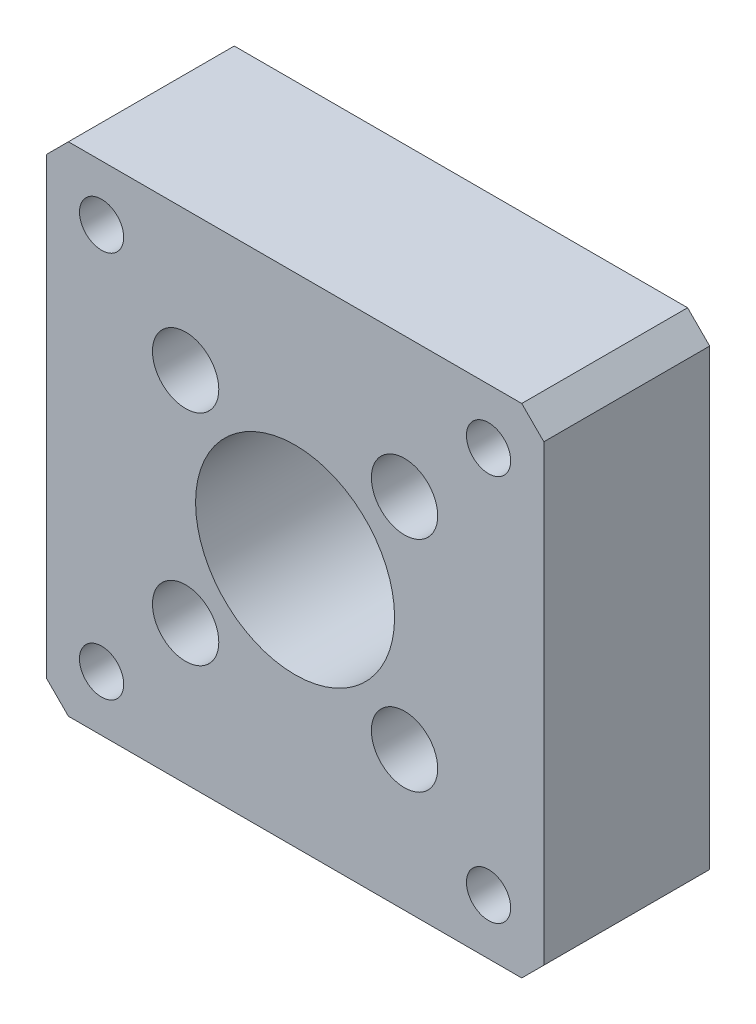
ISO-10303-21;
HEADER;
FILE_DESCRIPTION(('STEP AP214'),'2;1');
FILE_NAME('part.step','',(''),(''),'','','');
FILE_SCHEMA(('AUTOMOTIVE_DESIGN { 1 0 10303 214 1 1 1 1 }'));
ENDSEC;
DATA;
#1=APPLICATION_CONTEXT('core data for automotive mechanical design processes');
#2=APPLICATION_PROTOCOL_DEFINITION('international standard','automotive_design',2000,#1);
#3=PRODUCT_CONTEXT('',#1,'mechanical');
#4=PRODUCT('Part','Part','',(#3));
#5=PRODUCT_RELATED_PRODUCT_CATEGORY('part','',(#4));
#6=PRODUCT_DEFINITION_FORMATION('','',#4);
#7=PRODUCT_DEFINITION_CONTEXT('part definition',#1,'design');
#8=PRODUCT_DEFINITION('design','',#6,#7);
#9=PRODUCT_DEFINITION_SHAPE('','',#8);
#10=(LENGTH_UNIT() NAMED_UNIT(*) SI_UNIT(.MILLI.,.METRE.));
#11=(NAMED_UNIT(*) PLANE_ANGLE_UNIT() SI_UNIT($,.RADIAN.));
#12=(NAMED_UNIT(*) SI_UNIT($,.STERADIAN.) SOLID_ANGLE_UNIT());
#13=UNCERTAINTY_MEASURE_WITH_UNIT(LENGTH_MEASURE(1.E-05),#10,'distance_accuracy_value','');
#14=(GEOMETRIC_REPRESENTATION_CONTEXT(3) GLOBAL_UNCERTAINTY_ASSIGNED_CONTEXT((#13)) GLOBAL_UNIT_ASSIGNED_CONTEXT((#10,
#11,#12)) REPRESENTATION_CONTEXT('',''));
#15=CARTESIAN_POINT('',(0.,0.,0.));
#16=DIRECTION('',(0.,0.,1.));
#17=DIRECTION('',(1.,0.,0.));
#18=AXIS2_PLACEMENT_3D('',#15,#16,#17);
#19=CARTESIAN_POINT('',(0.,0.,15.));
#20=DIRECTION('',(0.,0.,-1.));
#21=DIRECTION('',(-1.,0.,0.));
#22=AXIS2_PLACEMENT_3D('',#19,#20,#21);
#23=CYLINDRICAL_SURFACE('',#22,9.);
#24=CARTESIAN_POINT('',(0.,0.,15.));
#25=DIRECTION('',(0.,0.,1.));
#26=DIRECTION('',(1.,0.,0.));
#27=AXIS2_PLACEMENT_3D('',#24,#25,#26);
#28=CIRCLE('',#27,9.);
#29=CARTESIAN_POINT('',(9.,0.,15.));
#30=VERTEX_POINT('',#29);
#31=EDGE_CURVE('E182',#30,#30,#28,.T.);
#32=ORIENTED_EDGE('',*,*,#31,.T.);
#33=EDGE_LOOP('',(#32));
#34=FACE_BOUND('',#33,.T.);
#35=CARTESIAN_POINT('',(0.,0.,2.));
#36=DIRECTION('',(0.,0.,-1.));
#37=DIRECTION('',(-1.,0.,0.));
#38=AXIS2_PLACEMENT_3D('',#35,#36,#37);
#39=CIRCLE('',#38,9.);
#40=CARTESIAN_POINT('',(-9.,0.,2.));
#41=VERTEX_POINT('',#40);
#42=EDGE_CURVE('E39',#41,#41,#39,.T.);
#43=ORIENTED_EDGE('',*,*,#42,.T.);
#44=EDGE_LOOP('',(#43));
#45=FACE_BOUND('',#44,.T.);
#46=ADVANCED_FACE('F35',(#34,#45),#23,.F.);
#47=CARTESIAN_POINT('',(9.89949493661165,9.89949493661168,-4.66690475583216));
#48=DIRECTION('',(0.,0.,1.));
#49=DIRECTION('',(1.,0.,0.));
#50=AXIS2_PLACEMENT_3D('',#47,#48,#49);
#51=CYLINDRICAL_SURFACE('',#50,1.65);
#52=CARTESIAN_POINT('',(9.89949493661165,9.89949493661168,0.));
#53=DIRECTION('',(0.,0.,1.));
#54=DIRECTION('',(1.,0.,0.));
#55=AXIS2_PLACEMENT_3D('',#52,#53,#54);
#56=CIRCLE('',#55,1.65);
#57=CARTESIAN_POINT('',(11.5494949366116,9.89949493661168,0.));
#58=VERTEX_POINT('',#57);
#59=EDGE_CURVE('E214',#58,#58,#56,.F.);
#60=ORIENTED_EDGE('',*,*,#59,.T.);
#61=EDGE_LOOP('',(#60));
#62=FACE_BOUND('',#61,.T.);
#63=CARTESIAN_POINT('',(9.89949493661165,9.89949493661168,7.));
#64=DIRECTION('',(0.,0.,1.));
#65=DIRECTION('',(1.,0.,0.));
#66=AXIS2_PLACEMENT_3D('',#63,#64,#65);
#67=CIRCLE('',#66,1.65);
#68=CARTESIAN_POINT('',(11.5494949366116,9.89949493661168,7.));
#69=VERTEX_POINT('',#68);
#70=EDGE_CURVE('E148',#69,#69,#67,.F.);
#71=ORIENTED_EDGE('',*,*,#70,.F.);
#72=EDGE_LOOP('',(#71));
#73=FACE_BOUND('',#72,.T.);
#74=ADVANCED_FACE('F271',(#62,#73),#51,.F.);
#75=CARTESIAN_POINT('',(9.89949493661165,-9.89949493661168,-4.66690475583216));
#76=DIRECTION('',(0.,0.,1.));
#77=DIRECTION('',(1.,0.,0.));
#78=AXIS2_PLACEMENT_3D('',#75,#76,#77);
#79=CYLINDRICAL_SURFACE('',#78,1.65);
#80=CARTESIAN_POINT('',(9.89949493661165,-9.89949493661168,0.));
#81=DIRECTION('',(0.,0.,1.));
#82=DIRECTION('',(1.,0.,0.));
#83=AXIS2_PLACEMENT_3D('',#80,#81,#82);
#84=CIRCLE('',#83,1.65);
#85=CARTESIAN_POINT('',(11.5494949366116,-9.89949493661168,0.));
#86=VERTEX_POINT('',#85);
#87=EDGE_CURVE('E219',#86,#86,#84,.F.);
#88=ORIENTED_EDGE('',*,*,#87,.T.);
#89=EDGE_LOOP('',(#88));
#90=FACE_BOUND('',#89,.T.);
#91=CARTESIAN_POINT('',(9.89949493661165,-9.89949493661168,7.));
#92=DIRECTION('',(0.,0.,1.));
#93=DIRECTION('',(1.,0.,0.));
#94=AXIS2_PLACEMENT_3D('',#91,#92,#93);
#95=CIRCLE('',#94,1.65);
#96=CARTESIAN_POINT('',(11.5494949366116,-9.89949493661168,7.));
#97=VERTEX_POINT('',#96);
#98=EDGE_CURVE('E145',#97,#97,#95,.F.);
#99=ORIENTED_EDGE('',*,*,#98,.F.);
#100=EDGE_LOOP('',(#99));
#101=FACE_BOUND('',#100,.T.);
#102=ADVANCED_FACE('F279',(#90,#101),#79,.F.);
#103=CARTESIAN_POINT('',(-9.89949493661137,-9.89949493661196,-4.66690475583216));
#104=DIRECTION('',(0.,0.,1.));
#105=DIRECTION('',(1.,0.,0.));
#106=AXIS2_PLACEMENT_3D('',#103,#104,#105);
#107=CYLINDRICAL_SURFACE('',#106,1.65000000000023);
#108=CARTESIAN_POINT('',(-9.89949493661137,-9.89949493661196,0.));
#109=DIRECTION('',(0.,0.,1.));
#110=DIRECTION('',(1.,0.,0.));
#111=AXIS2_PLACEMENT_3D('',#108,#109,#110);
#112=CIRCLE('',#111,1.65000000000023);
#113=CARTESIAN_POINT('',(-8.24949493661114,-9.89949493661196,0.));
#114=VERTEX_POINT('',#113);
#115=EDGE_CURVE('E222',#114,#114,#112,.F.);
#116=ORIENTED_EDGE('',*,*,#115,.T.);
#117=EDGE_LOOP('',(#116));
#118=FACE_BOUND('',#117,.T.);
#119=CARTESIAN_POINT('',(-9.89949493661137,-9.89949493661196,7.));
#120=DIRECTION('',(0.,0.,1.));
#121=DIRECTION('',(1.,0.,0.));
#122=AXIS2_PLACEMENT_3D('',#119,#120,#121);
#123=CIRCLE('',#122,1.65000000000023);
#124=CARTESIAN_POINT('',(-8.24949493661114,-9.89949493661196,7.));
#125=VERTEX_POINT('',#124);
#126=EDGE_CURVE('E141',#125,#125,#123,.F.);
#127=ORIENTED_EDGE('',*,*,#126,.F.);
#128=EDGE_LOOP('',(#127));
#129=FACE_BOUND('',#128,.T.);
#130=ADVANCED_FACE('F399',(#118,#129),#107,.F.);
#131=CARTESIAN_POINT('',(-9.89949493661168,9.89949493661137,-4.66690475583216));
#132=DIRECTION('',(0.,0.,1.));
#133=DIRECTION('',(1.,0.,0.));
#134=AXIS2_PLACEMENT_3D('',#131,#132,#133);
#135=CYLINDRICAL_SURFACE('',#134,1.65000000000033);
#136=CARTESIAN_POINT('',(-9.89949493661168,9.89949493661137,0.));
#137=DIRECTION('',(0.,0.,1.));
#138=DIRECTION('',(1.,0.,0.));
#139=AXIS2_PLACEMENT_3D('',#136,#137,#138);
#140=CIRCLE('',#139,1.65000000000033);
#141=CARTESIAN_POINT('',(-8.24949493661135,9.89949493661137,0.));
#142=VERTEX_POINT('',#141);
#143=EDGE_CURVE('E151',#142,#142,#140,.F.);
#144=ORIENTED_EDGE('',*,*,#143,.T.);
#145=EDGE_LOOP('',(#144));
#146=FACE_BOUND('',#145,.T.);
#147=CARTESIAN_POINT('',(-9.89949493661168,9.89949493661137,7.));
#148=DIRECTION('',(0.,0.,1.));
#149=DIRECTION('',(1.,0.,0.));
#150=AXIS2_PLACEMENT_3D('',#147,#148,#149);
#151=CIRCLE('',#150,1.65000000000033);
#152=CARTESIAN_POINT('',(-8.24949493661135,9.89949493661137,7.));
#153=VERTEX_POINT('',#152);
#154=EDGE_CURVE('E138',#153,#153,#151,.F.);
#155=ORIENTED_EDGE('',*,*,#154,.F.);
#156=EDGE_LOOP('',(#155));
#157=FACE_BOUND('',#156,.T.);
#158=ADVANCED_FACE('F289',(#146,#157),#135,.F.);
#159=CARTESIAN_POINT('',(0.,0.,15.));
#160=DIRECTION('',(0.,0.,1.));
#161=DIRECTION('',(1.,0.,0.));
#162=AXIS2_PLACEMENT_3D('',#159,#160,#161);
#163=PLANE('',#162);
#164=CARTESIAN_POINT('',(-9.89949493661168,9.89949493661137,15.));
#165=DIRECTION('',(0.,0.,1.));
#166=DIRECTION('',(1.,0.,0.));
#167=AXIS2_PLACEMENT_3D('',#164,#165,#166);
#168=CIRCLE('',#167,3.00000000000033);
#169=CARTESIAN_POINT('',(-6.89949493661135,9.89949493661137,15.));
#170=VERTEX_POINT('',#169);
#171=EDGE_CURVE('E237',#170,#170,#168,.T.);
#172=ORIENTED_EDGE('',*,*,#171,.F.);
#173=EDGE_LOOP('',(#172));
#174=FACE_BOUND('',#173,.T.);
#175=CARTESIAN_POINT('',(-9.89949493661137,-9.89949493661196,15.));
#176=DIRECTION('',(0.,0.,1.));
#177=DIRECTION('',(1.,0.,0.));
#178=AXIS2_PLACEMENT_3D('',#175,#176,#177);
#179=CIRCLE('',#178,3.00000000000023);
#180=CARTESIAN_POINT('',(-6.89949493661114,-9.89949493661196,15.));
#181=VERTEX_POINT('',#180);
#182=EDGE_CURVE('E236',#181,#181,#179,.T.);
#183=ORIENTED_EDGE('',*,*,#182,.F.);
#184=EDGE_LOOP('',(#183));
#185=FACE_BOUND('',#184,.T.);
#186=CARTESIAN_POINT('',(9.89949493661196,-9.89949493661165,15.));
#187=DIRECTION('',(0.,0.,1.));
#188=DIRECTION('',(1.,0.,0.));
#189=AXIS2_PLACEMENT_3D('',#186,#187,#188);
#190=CIRCLE('',#189,2.99999999999994);
#191=CARTESIAN_POINT('',(12.8994949366119,-9.89949493661165,15.));
#192=VERTEX_POINT('',#191);
#193=EDGE_CURVE('E243',#192,#192,#190,.T.);
#194=ORIENTED_EDGE('',*,*,#193,.F.);
#195=EDGE_LOOP('',(#194));
#196=FACE_BOUND('',#195,.T.);
#197=CARTESIAN_POINT('',(9.89949493661165,9.89949493661168,15.));
#198=DIRECTION('',(0.,0.,1.));
#199=DIRECTION('',(1.,0.,0.));
#200=AXIS2_PLACEMENT_3D('',#197,#198,#199);
#201=CIRCLE('',#200,3.);
#202=CARTESIAN_POINT('',(12.8994949366116,9.89949493661168,15.));
#203=VERTEX_POINT('',#202);
#204=EDGE_CURVE('E229',#203,#203,#201,.T.);
#205=ORIENTED_EDGE('',*,*,#204,.F.);
#206=EDGE_LOOP('',(#205));
#207=FACE_BOUND('',#206,.T.);
#208=CARTESIAN_POINT('',(17.4999999999999,-17.5,15.));
#209=DIRECTION('',(0.,0.,1.));
#210=DIRECTION('',(1.,0.,0.));
#211=AXIS2_PLACEMENT_3D('',#208,#209,#210);
#212=CIRCLE('',#211,2.);
#213=CARTESIAN_POINT('',(19.4999999999999,-17.5,15.));
#214=VERTEX_POINT('',#213);
#215=EDGE_CURVE('E202',#214,#214,#212,.T.);
#216=ORIENTED_EDGE('',*,*,#215,.F.);
#217=EDGE_LOOP('',(#216));
#218=FACE_BOUND('',#217,.T.);
#219=CARTESIAN_POINT('',(-17.5000000000001,17.5,15.));
#220=DIRECTION('',(0.,0.,1.));
#221=DIRECTION('',(1.,0.,0.));
#222=AXIS2_PLACEMENT_3D('',#219,#220,#221);
#223=CIRCLE('',#222,2.);
#224=CARTESIAN_POINT('',(-15.5000000000001,17.5,15.));
#225=VERTEX_POINT('',#224);
#226=EDGE_CURVE('E185',#225,#225,#223,.T.);
#227=ORIENTED_EDGE('',*,*,#226,.F.);
#228=EDGE_LOOP('',(#227));
#229=FACE_BOUND('',#228,.T.);
#230=DIRECTION('',(0.,-1.,0.));
#231=VECTOR('',#230,1.);
#232=CARTESIAN_POINT('',(-22.5,22.5,15.));
#233=LINE('',#232,#231);
#234=CARTESIAN_POINT('',(-22.5,20.5,15.));
#235=VERTEX_POINT('',#234);
#236=CARTESIAN_POINT('',(-22.5,-20.5,15.));
#237=VERTEX_POINT('',#236);
#238=EDGE_CURVE('E189',#235,#237,#233,.T.);
#239=ORIENTED_EDGE('',*,*,#238,.T.);
#240=DIRECTION('',(-0.707106781186545,0.70710678118655,0.));
#241=VECTOR('',#240,1.);
#242=CARTESIAN_POINT('',(-21.5000000000001,-21.4999999999999,15.));
#243=LINE('',#242,#241);
#244=CARTESIAN_POINT('',(-20.5,-22.5,15.));
#245=VERTEX_POINT('',#244);
#246=EDGE_CURVE('E165',#237,#245,#243,.F.);
#247=ORIENTED_EDGE('',*,*,#246,.T.);
#248=DIRECTION('',(1.,0.,0.));
#249=VECTOR('',#248,1.);
#250=CARTESIAN_POINT('',(-22.5,-22.5,15.));
#251=LINE('',#250,#249);
#252=CARTESIAN_POINT('',(20.5,-22.5,15.));
#253=VERTEX_POINT('',#252);
#254=EDGE_CURVE('E122',#245,#253,#251,.T.);
#255=ORIENTED_EDGE('',*,*,#254,.T.);
#256=DIRECTION('',(-0.707106781186549,-0.707106781186546,0.));
#257=VECTOR('',#256,1.);
#258=CARTESIAN_POINT('',(21.5,-21.5,15.));
#259=LINE('',#258,#257);
#260=CARTESIAN_POINT('',(22.5,-20.5,15.));
#261=VERTEX_POINT('',#260);
#262=EDGE_CURVE('E163',#253,#261,#259,.F.);
#263=ORIENTED_EDGE('',*,*,#262,.T.);
#264=DIRECTION('',(0.,1.,0.));
#265=VECTOR('',#264,1.);
#266=CARTESIAN_POINT('',(22.5,22.5,15.));
#267=LINE('',#266,#265);
#268=CARTESIAN_POINT('',(22.5,20.5,15.));
#269=VERTEX_POINT('',#268);
#270=EDGE_CURVE('E129',#261,#269,#267,.T.);
#271=ORIENTED_EDGE('',*,*,#270,.T.);
#272=DIRECTION('',(0.707106781186548,-0.707106781186548,0.));
#273=VECTOR('',#272,1.);
#274=CARTESIAN_POINT('',(21.5,21.5,15.));
#275=LINE('',#274,#273);
#276=CARTESIAN_POINT('',(20.5,22.5,15.));
#277=VERTEX_POINT('',#276);
#278=EDGE_CURVE('E57',#269,#277,#275,.F.);
#279=ORIENTED_EDGE('',*,*,#278,.T.);
#280=DIRECTION('',(-1.,0.,0.));
#281=VECTOR('',#280,1.);
#282=CARTESIAN_POINT('',(-22.5,22.5,15.));
#283=LINE('',#282,#281);
#284=CARTESIAN_POINT('',(-20.5,22.5,15.));
#285=VERTEX_POINT('',#284);
#286=EDGE_CURVE('E132',#277,#285,#283,.T.);
#287=ORIENTED_EDGE('',*,*,#286,.T.);
#288=DIRECTION('',(0.707106781186549,0.707106781186546,0.));
#289=VECTOR('',#288,1.);
#290=CARTESIAN_POINT('',(-21.5,21.5,15.));
#291=LINE('',#290,#289);
#292=EDGE_CURVE('E160',#285,#235,#291,.F.);
#293=ORIENTED_EDGE('',*,*,#292,.T.);
#294=EDGE_LOOP('',(#239,#247,#255,#263,#271,#279,#287,#293));
#295=FACE_BOUND('',#294,.T.);
#296=ORIENTED_EDGE('',*,*,#31,.F.);
#297=EDGE_LOOP('',(#296));
#298=FACE_BOUND('',#297,.T.);
#299=CARTESIAN_POINT('',(17.4999999999999,17.5,15.));
#300=DIRECTION('',(0.,0.,1.));
#301=DIRECTION('',(1.,0.,0.));
#302=AXIS2_PLACEMENT_3D('',#299,#300,#301);
#303=CIRCLE('',#302,2.);
#304=CARTESIAN_POINT('',(19.4999999999999,17.5,15.));
#305=VERTEX_POINT('',#304);
#306=EDGE_CURVE('E196',#305,#305,#303,.T.);
#307=ORIENTED_EDGE('',*,*,#306,.F.);
#308=EDGE_LOOP('',(#307));
#309=FACE_BOUND('',#308,.T.);
#310=CARTESIAN_POINT('',(-17.5000000000001,-17.5,15.));
#311=DIRECTION('',(0.,0.,1.));
#312=DIRECTION('',(1.,0.,0.));
#313=AXIS2_PLACEMENT_3D('',#310,#311,#312);
#314=CIRCLE('',#313,2.00000000000001);
#315=CARTESIAN_POINT('',(-15.5000000000001,-17.5,15.));
#316=VERTEX_POINT('',#315);
#317=EDGE_CURVE('E208',#316,#316,#314,.T.);
#318=ORIENTED_EDGE('',*,*,#317,.F.);
#319=EDGE_LOOP('',(#318));
#320=FACE_BOUND('',#319,.T.);
#321=ADVANCED_FACE('F286',(#174,#185,#196,#207,#218,#229,#295,#298,#309,#320),#163,.T.);
#322=CARTESIAN_POINT('',(0.,0.,0.));
#323=DIRECTION('',(0.,0.,1.));
#324=DIRECTION('',(1.,0.,0.));
#325=AXIS2_PLACEMENT_3D('',#322,#323,#324);
#326=PLANE('',#325);
#327=CARTESIAN_POINT('',(0.,0.,0.));
#328=DIRECTION('',(0.,0.,-1.));
#329=DIRECTION('',(-1.,0.,0.));
#330=AXIS2_PLACEMENT_3D('',#327,#328,#329);
#331=CIRCLE('',#330,11.2);
#332=CARTESIAN_POINT('',(-11.2,0.,0.));
#333=VERTEX_POINT('',#332);
#334=EDGE_CURVE('E250',#333,#333,#331,.T.);
#335=ORIENTED_EDGE('',*,*,#334,.F.);
#336=EDGE_LOOP('',(#335));
#337=FACE_BOUND('',#336,.T.);
#338=ORIENTED_EDGE('',*,*,#143,.F.);
#339=EDGE_LOOP('',(#338));
#340=FACE_BOUND('',#339,.T.);
#341=ORIENTED_EDGE('',*,*,#115,.F.);
#342=EDGE_LOOP('',(#341));
#343=FACE_BOUND('',#342,.T.);
#344=ORIENTED_EDGE('',*,*,#87,.F.);
#345=EDGE_LOOP('',(#344));
#346=FACE_BOUND('',#345,.T.);
#347=ORIENTED_EDGE('',*,*,#59,.F.);
#348=EDGE_LOOP('',(#347));
#349=FACE_BOUND('',#348,.T.);
#350=DIRECTION('',(1.,0.,0.));
#351=VECTOR('',#350,1.);
#352=CARTESIAN_POINT('',(-22.5,-22.5,0.));
#353=LINE('',#352,#351);
#354=CARTESIAN_POINT('',(-20.5,-22.5,0.));
#355=VERTEX_POINT('',#354);
#356=CARTESIAN_POINT('',(20.5,-22.5,0.));
#357=VERTEX_POINT('',#356);
#358=EDGE_CURVE('E119',#355,#357,#353,.T.);
#359=ORIENTED_EDGE('',*,*,#358,.F.);
#360=DIRECTION('',(0.707106781186545,-0.70710678118655,0.));
#361=VECTOR('',#360,1.);
#362=CARTESIAN_POINT('',(-20.5,-22.5,0.));
#363=LINE('',#362,#361);
#364=CARTESIAN_POINT('',(-22.5,-20.5,0.));
#365=VERTEX_POINT('',#364);
#366=EDGE_CURVE('E102',#355,#365,#363,.F.);
#367=ORIENTED_EDGE('',*,*,#366,.T.);
#368=DIRECTION('',(0.,-1.,0.));
#369=VECTOR('',#368,1.);
#370=CARTESIAN_POINT('',(-22.5,22.5,0.));
#371=LINE('',#370,#369);
#372=CARTESIAN_POINT('',(-22.5,20.5,0.));
#373=VERTEX_POINT('',#372);
#374=EDGE_CURVE('E130',#373,#365,#371,.T.);
#375=ORIENTED_EDGE('',*,*,#374,.F.);
#376=DIRECTION('',(-0.707106781186549,-0.707106781186546,0.));
#377=VECTOR('',#376,1.);
#378=CARTESIAN_POINT('',(-22.5,20.5,0.));
#379=LINE('',#378,#377);
#380=CARTESIAN_POINT('',(-20.5,22.5,0.));
#381=VERTEX_POINT('',#380);
#382=EDGE_CURVE('E123',#373,#381,#379,.F.);
#383=ORIENTED_EDGE('',*,*,#382,.T.);
#384=DIRECTION('',(-1.,0.,0.));
#385=VECTOR('',#384,1.);
#386=CARTESIAN_POINT('',(-22.5,22.5,0.));
#387=LINE('',#386,#385);
#388=CARTESIAN_POINT('',(20.5,22.5,0.));
#389=VERTEX_POINT('',#388);
#390=EDGE_CURVE('E134',#389,#381,#387,.T.);
#391=ORIENTED_EDGE('',*,*,#390,.F.);
#392=DIRECTION('',(-0.707106781186548,0.707106781186548,0.));
#393=VECTOR('',#392,1.);
#394=CARTESIAN_POINT('',(20.5,22.5,0.));
#395=LINE('',#394,#393);
#396=CARTESIAN_POINT('',(22.5,20.5,0.));
#397=VERTEX_POINT('',#396);
#398=EDGE_CURVE('E154',#389,#397,#395,.F.);
#399=ORIENTED_EDGE('',*,*,#398,.T.);
#400=DIRECTION('',(0.,1.,0.));
#401=VECTOR('',#400,1.);
#402=CARTESIAN_POINT('',(22.5,22.5,0.));
#403=LINE('',#402,#401);
#404=CARTESIAN_POINT('',(22.5,-20.5,0.));
#405=VERTEX_POINT('',#404);
#406=EDGE_CURVE('E177',#405,#397,#403,.T.);
#407=ORIENTED_EDGE('',*,*,#406,.F.);
#408=DIRECTION('',(0.707106781186549,0.707106781186546,0.));
#409=VECTOR('',#408,1.);
#410=CARTESIAN_POINT('',(22.5,-20.5,0.));
#411=LINE('',#410,#409);
#412=EDGE_CURVE('E113',#405,#357,#411,.F.);
#413=ORIENTED_EDGE('',*,*,#412,.T.);
#414=EDGE_LOOP('',(#359,#367,#375,#383,#391,#399,#407,#413));
#415=FACE_BOUND('',#414,.T.);
#416=CARTESIAN_POINT('',(-17.5000000000001,17.5,0.));
#417=DIRECTION('',(0.,0.,1.));
#418=DIRECTION('',(1.,0.,0.));
#419=AXIS2_PLACEMENT_3D('',#416,#417,#418);
#420=CIRCLE('',#419,2.);
#421=CARTESIAN_POINT('',(-15.5000000000001,17.5,0.));
#422=VERTEX_POINT('',#421);
#423=EDGE_CURVE('E193',#422,#422,#420,.T.);
#424=ORIENTED_EDGE('',*,*,#423,.T.);
#425=EDGE_LOOP('',(#424));
#426=FACE_BOUND('',#425,.T.);
#427=CARTESIAN_POINT('',(17.4999999999999,17.5,0.));
#428=DIRECTION('',(0.,0.,1.));
#429=DIRECTION('',(1.,0.,0.));
#430=AXIS2_PLACEMENT_3D('',#427,#428,#429);
#431=CIRCLE('',#430,2.);
#432=CARTESIAN_POINT('',(19.4999999999999,17.5,0.));
#433=VERTEX_POINT('',#432);
#434=EDGE_CURVE('E199',#433,#433,#431,.T.);
#435=ORIENTED_EDGE('',*,*,#434,.T.);
#436=EDGE_LOOP('',(#435));
#437=FACE_BOUND('',#436,.T.);
#438=CARTESIAN_POINT('',(17.4999999999999,-17.5,0.));
#439=DIRECTION('',(0.,0.,1.));
#440=DIRECTION('',(1.,0.,0.));
#441=AXIS2_PLACEMENT_3D('',#438,#439,#440);
#442=CIRCLE('',#441,2.);
#443=CARTESIAN_POINT('',(19.4999999999999,-17.5,0.));
#444=VERTEX_POINT('',#443);
#445=EDGE_CURVE('E205',#444,#444,#442,.T.);
#446=ORIENTED_EDGE('',*,*,#445,.T.);
#447=EDGE_LOOP('',(#446));
#448=FACE_BOUND('',#447,.T.);
#449=CARTESIAN_POINT('',(-17.5000000000001,-17.5,0.));
#450=DIRECTION('',(0.,0.,1.));
#451=DIRECTION('',(1.,0.,0.));
#452=AXIS2_PLACEMENT_3D('',#449,#450,#451);
#453=CIRCLE('',#452,2.00000000000001);
#454=CARTESIAN_POINT('',(-15.5000000000001,-17.5,0.));
#455=VERTEX_POINT('',#454);
#456=EDGE_CURVE('E211',#455,#455,#453,.T.);
#457=ORIENTED_EDGE('',*,*,#456,.T.);
#458=EDGE_LOOP('',(#457));
#459=FACE_BOUND('',#458,.T.);
#460=ADVANCED_FACE('F126',(#337,#340,#343,#346,#349,#415,#426,#437,#448,#459),#326,.F.);
#461=CARTESIAN_POINT('',(22.5,22.5,15.));
#462=DIRECTION('',(-1.,0.,0.));
#463=DIRECTION('',(0.,0.,1.));
#464=AXIS2_PLACEMENT_3D('',#461,#462,#463);
#465=PLANE('',#464);
#466=ORIENTED_EDGE('',*,*,#270,.F.);
#467=DIRECTION('',(0.,0.,-1.));
#468=VECTOR('',#467,1.);
#469=CARTESIAN_POINT('',(22.5,-20.5,15.));
#470=LINE('',#469,#468);
#471=EDGE_CURVE('E169',#261,#405,#470,.T.);
#472=ORIENTED_EDGE('',*,*,#471,.T.);
#473=ORIENTED_EDGE('',*,*,#406,.T.);
#474=DIRECTION('',(0.,0.,1.));
#475=VECTOR('',#474,1.);
#476=CARTESIAN_POINT('',(22.5,20.5,15.));
#477=LINE('',#476,#475);
#478=EDGE_CURVE('E167',#397,#269,#477,.T.);
#479=ORIENTED_EDGE('',*,*,#478,.T.);
#480=EDGE_LOOP('',(#466,#472,#473,#479));
#481=FACE_BOUND('',#480,.T.);
#482=ADVANCED_FACE('F176',(#481),#465,.F.);
#483=CARTESIAN_POINT('',(-22.5,22.5,15.));
#484=DIRECTION('',(0.,-1.,0.));
#485=DIRECTION('',(0.,0.,-1.));
#486=AXIS2_PLACEMENT_3D('',#483,#484,#485);
#487=PLANE('',#486);
#488=ORIENTED_EDGE('',*,*,#286,.F.);
#489=DIRECTION('',(0.,0.,-1.));
#490=VECTOR('',#489,1.);
#491=CARTESIAN_POINT('',(20.5,22.5,15.));
#492=LINE('',#491,#490);
#493=EDGE_CURVE('E12',#277,#389,#492,.T.);
#494=ORIENTED_EDGE('',*,*,#493,.T.);
#495=ORIENTED_EDGE('',*,*,#390,.T.);
#496=DIRECTION('',(0.,0.,1.));
#497=VECTOR('',#496,1.);
#498=CARTESIAN_POINT('',(-20.5,22.5,15.));
#499=LINE('',#498,#497);
#500=EDGE_CURVE('E44',#381,#285,#499,.T.);
#501=ORIENTED_EDGE('',*,*,#500,.T.);
#502=EDGE_LOOP('',(#488,#494,#495,#501));
#503=FACE_BOUND('',#502,.T.);
#504=ADVANCED_FACE('F298',(#503),#487,.F.);
#505=CARTESIAN_POINT('',(-22.5,22.5,15.));
#506=DIRECTION('',(1.,0.,0.));
#507=DIRECTION('',(0.,1.,0.));
#508=AXIS2_PLACEMENT_3D('',#505,#506,#507);
#509=PLANE('',#508);
#510=ORIENTED_EDGE('',*,*,#374,.T.);
#511=DIRECTION('',(0.,0.,1.));
#512=VECTOR('',#511,1.);
#513=CARTESIAN_POINT('',(-22.5,-20.5,15.));
#514=LINE('',#513,#512);
#515=EDGE_CURVE('E107',#365,#237,#514,.T.);
#516=ORIENTED_EDGE('',*,*,#515,.T.);
#517=ORIENTED_EDGE('',*,*,#238,.F.);
#518=DIRECTION('',(0.,0.,-1.));
#519=VECTOR('',#518,1.);
#520=CARTESIAN_POINT('',(-22.5,20.5,15.));
#521=LINE('',#520,#519);
#522=EDGE_CURVE('E112',#235,#373,#521,.T.);
#523=ORIENTED_EDGE('',*,*,#522,.T.);
#524=EDGE_LOOP('',(#510,#516,#517,#523));
#525=FACE_BOUND('',#524,.T.);
#526=ADVANCED_FACE('F295',(#525),#509,.F.);
#527=CARTESIAN_POINT('',(-22.5,-22.5,15.));
#528=DIRECTION('',(0.,1.,0.));
#529=DIRECTION('',(0.,0.,1.));
#530=AXIS2_PLACEMENT_3D('',#527,#528,#529);
#531=PLANE('',#530);
#532=ORIENTED_EDGE('',*,*,#254,.F.);
#533=DIRECTION('',(0.,0.,-1.));
#534=VECTOR('',#533,1.);
#535=CARTESIAN_POINT('',(-20.5,-22.5,15.));
#536=LINE('',#535,#534);
#537=EDGE_CURVE('E106',#245,#355,#536,.T.);
#538=ORIENTED_EDGE('',*,*,#537,.T.);
#539=ORIENTED_EDGE('',*,*,#358,.T.);
#540=DIRECTION('',(0.,0.,1.));
#541=VECTOR('',#540,1.);
#542=CARTESIAN_POINT('',(20.5,-22.5,15.));
#543=LINE('',#542,#541);
#544=EDGE_CURVE('E124',#357,#253,#543,.T.);
#545=ORIENTED_EDGE('',*,*,#544,.T.);
#546=EDGE_LOOP('',(#532,#538,#539,#545));
#547=FACE_BOUND('',#546,.T.);
#548=ADVANCED_FACE('F118',(#547),#531,.F.);
#549=CARTESIAN_POINT('',(-17.5000000000001,17.5,15.));
#550=DIRECTION('',(0.,0.,-1.));
#551=DIRECTION('',(-1.,0.,0.));
#552=AXIS2_PLACEMENT_3D('',#549,#550,#551);
#553=CYLINDRICAL_SURFACE('',#552,2.);
#554=ORIENTED_EDGE('',*,*,#226,.T.);
#555=EDGE_LOOP('',(#554));
#556=FACE_BOUND('',#555,.T.);
#557=ORIENTED_EDGE('',*,*,#423,.F.);
#558=EDGE_LOOP('',(#557));
#559=FACE_BOUND('',#558,.T.);
#560=ADVANCED_FACE('F284',(#556,#559),#553,.F.);
#561=CARTESIAN_POINT('',(17.4999999999999,17.5,15.));
#562=DIRECTION('',(0.,0.,-1.));
#563=DIRECTION('',(-1.,0.,0.));
#564=AXIS2_PLACEMENT_3D('',#561,#562,#563);
#565=CYLINDRICAL_SURFACE('',#564,2.);
#566=ORIENTED_EDGE('',*,*,#306,.T.);
#567=EDGE_LOOP('',(#566));
#568=FACE_BOUND('',#567,.T.);
#569=ORIENTED_EDGE('',*,*,#434,.F.);
#570=EDGE_LOOP('',(#569));
#571=FACE_BOUND('',#570,.T.);
#572=ADVANCED_FACE('F342',(#568,#571),#565,.F.);
#573=CARTESIAN_POINT('',(17.4999999999999,-17.5,15.));
#574=DIRECTION('',(0.,0.,-1.));
#575=DIRECTION('',(-1.,0.,0.));
#576=AXIS2_PLACEMENT_3D('',#573,#574,#575);
#577=CYLINDRICAL_SURFACE('',#576,2.);
#578=ORIENTED_EDGE('',*,*,#215,.T.);
#579=EDGE_LOOP('',(#578));
#580=FACE_BOUND('',#579,.T.);
#581=ORIENTED_EDGE('',*,*,#445,.F.);
#582=EDGE_LOOP('',(#581));
#583=FACE_BOUND('',#582,.T.);
#584=ADVANCED_FACE('F331',(#580,#583),#577,.F.);
#585=CARTESIAN_POINT('',(-17.5000000000001,-17.5,15.));
#586=DIRECTION('',(0.,0.,-1.));
#587=DIRECTION('',(-1.,0.,0.));
#588=AXIS2_PLACEMENT_3D('',#585,#586,#587);
#589=CYLINDRICAL_SURFACE('',#588,2.00000000000001);
#590=ORIENTED_EDGE('',*,*,#317,.T.);
#591=EDGE_LOOP('',(#590));
#592=FACE_BOUND('',#591,.T.);
#593=ORIENTED_EDGE('',*,*,#456,.F.);
#594=EDGE_LOOP('',(#593));
#595=FACE_BOUND('',#594,.T.);
#596=ADVANCED_FACE('F327',(#592,#595),#589,.F.);
#597=CARTESIAN_POINT('',(0.,0.,7.));
#598=DIRECTION('',(0.,0.,1.));
#599=DIRECTION('',(1.,0.,0.));
#600=AXIS2_PLACEMENT_3D('',#597,#598,#599);
#601=PLANE('',#600);
#602=CARTESIAN_POINT('',(-9.89949493661168,9.89949493661137,7.));
#603=DIRECTION('',(0.,0.,1.));
#604=DIRECTION('',(1.,0.,0.));
#605=AXIS2_PLACEMENT_3D('',#602,#603,#604);
#606=CIRCLE('',#605,3.00000000000033);
#607=CARTESIAN_POINT('',(-6.89949493661135,9.89949493661137,7.));
#608=VERTEX_POINT('',#607);
#609=EDGE_CURVE('E233',#608,#608,#606,.F.);
#610=ORIENTED_EDGE('',*,*,#609,.F.);
#611=EDGE_LOOP('',(#610));
#612=FACE_BOUND('',#611,.T.);
#613=ORIENTED_EDGE('',*,*,#154,.T.);
#614=EDGE_LOOP('',(#613));
#615=FACE_BOUND('',#614,.T.);
#616=ADVANCED_FACE('F330',(#612,#615),#601,.T.);
#617=CARTESIAN_POINT('',(-9.89949493661168,9.89949493661137,-8.48528137423951));
#618=DIRECTION('',(0.,0.,1.));
#619=DIRECTION('',(1.,0.,0.));
#620=AXIS2_PLACEMENT_3D('',#617,#618,#619);
#621=CYLINDRICAL_SURFACE('',#620,3.00000000000033);
#622=ORIENTED_EDGE('',*,*,#609,.T.);
#623=EDGE_LOOP('',(#622));
#624=FACE_BOUND('',#623,.T.);
#625=ORIENTED_EDGE('',*,*,#171,.T.);
#626=EDGE_LOOP('',(#625));
#627=FACE_BOUND('',#626,.T.);
#628=ADVANCED_FACE('F339',(#624,#627),#621,.F.);
#629=CARTESIAN_POINT('',(0.,0.,7.));
#630=DIRECTION('',(0.,0.,1.));
#631=DIRECTION('',(1.,0.,0.));
#632=AXIS2_PLACEMENT_3D('',#629,#630,#631);
#633=PLANE('',#632);
#634=CARTESIAN_POINT('',(-9.89949493661137,-9.89949493661196,7.));
#635=DIRECTION('',(0.,0.,1.));
#636=DIRECTION('',(1.,0.,0.));
#637=AXIS2_PLACEMENT_3D('',#634,#635,#636);
#638=CIRCLE('',#637,3.00000000000023);
#639=CARTESIAN_POINT('',(-6.89949493661114,-9.89949493661196,7.));
#640=VERTEX_POINT('',#639);
#641=EDGE_CURVE('E240',#640,#640,#638,.F.);
#642=ORIENTED_EDGE('',*,*,#641,.F.);
#643=EDGE_LOOP('',(#642));
#644=FACE_BOUND('',#643,.T.);
#645=ORIENTED_EDGE('',*,*,#126,.T.);
#646=EDGE_LOOP('',(#645));
#647=FACE_BOUND('',#646,.T.);
#648=ADVANCED_FACE('F463',(#644,#647),#633,.T.);
#649=CARTESIAN_POINT('',(-9.89949493661137,-9.89949493661196,-8.48528137423951));
#650=DIRECTION('',(0.,0.,1.));
#651=DIRECTION('',(1.,0.,0.));
#652=AXIS2_PLACEMENT_3D('',#649,#650,#651);
#653=CYLINDRICAL_SURFACE('',#652,3.00000000000023);
#654=ORIENTED_EDGE('',*,*,#641,.T.);
#655=EDGE_LOOP('',(#654));
#656=FACE_BOUND('',#655,.T.);
#657=ORIENTED_EDGE('',*,*,#182,.T.);
#658=EDGE_LOOP('',(#657));
#659=FACE_BOUND('',#658,.T.);
#660=ADVANCED_FACE('F472',(#656,#659),#653,.F.);
#661=CARTESIAN_POINT('',(0.,0.,7.));
#662=DIRECTION('',(0.,0.,1.));
#663=DIRECTION('',(1.,0.,0.));
#664=AXIS2_PLACEMENT_3D('',#661,#662,#663);
#665=PLANE('',#664);
#666=CARTESIAN_POINT('',(9.89949493661196,-9.89949493661165,7.));
#667=DIRECTION('',(0.,0.,1.));
#668=DIRECTION('',(1.,0.,0.));
#669=AXIS2_PLACEMENT_3D('',#666,#667,#668);
#670=CIRCLE('',#669,2.99999999999994);
#671=CARTESIAN_POINT('',(12.8994949366119,-9.89949493661165,7.));
#672=VERTEX_POINT('',#671);
#673=EDGE_CURVE('E232',#672,#672,#670,.F.);
#674=ORIENTED_EDGE('',*,*,#673,.F.);
#675=EDGE_LOOP('',(#674));
#676=FACE_BOUND('',#675,.T.);
#677=ORIENTED_EDGE('',*,*,#98,.T.);
#678=EDGE_LOOP('',(#677));
#679=FACE_BOUND('',#678,.T.);
#680=ADVANCED_FACE('F481',(#676,#679),#665,.T.);
#681=CARTESIAN_POINT('',(9.89949493661196,-9.89949493661165,-8.48528137423951));
#682=DIRECTION('',(0.,0.,1.));
#683=DIRECTION('',(1.,0.,0.));
#684=AXIS2_PLACEMENT_3D('',#681,#682,#683);
#685=CYLINDRICAL_SURFACE('',#684,2.99999999999994);
#686=ORIENTED_EDGE('',*,*,#673,.T.);
#687=EDGE_LOOP('',(#686));
#688=FACE_BOUND('',#687,.T.);
#689=ORIENTED_EDGE('',*,*,#193,.T.);
#690=EDGE_LOOP('',(#689));
#691=FACE_BOUND('',#690,.T.);
#692=ADVANCED_FACE('F490',(#688,#691),#685,.F.);
#693=CARTESIAN_POINT('',(0.,0.,7.));
#694=DIRECTION('',(0.,0.,1.));
#695=DIRECTION('',(1.,0.,0.));
#696=AXIS2_PLACEMENT_3D('',#693,#694,#695);
#697=PLANE('',#696);
#698=CARTESIAN_POINT('',(9.89949493661165,9.89949493661168,7.));
#699=DIRECTION('',(0.,0.,1.));
#700=DIRECTION('',(1.,0.,0.));
#701=AXIS2_PLACEMENT_3D('',#698,#699,#700);
#702=CIRCLE('',#701,3.);
#703=CARTESIAN_POINT('',(12.8994949366116,9.89949493661168,7.));
#704=VERTEX_POINT('',#703);
#705=EDGE_CURVE('E142',#704,#704,#702,.F.);
#706=ORIENTED_EDGE('',*,*,#705,.F.);
#707=EDGE_LOOP('',(#706));
#708=FACE_BOUND('',#707,.T.);
#709=ORIENTED_EDGE('',*,*,#70,.T.);
#710=EDGE_LOOP('',(#709));
#711=FACE_BOUND('',#710,.T.);
#712=ADVANCED_FACE('F499',(#708,#711),#697,.T.);
#713=CARTESIAN_POINT('',(9.89949493661165,9.89949493661168,-8.48528137423951));
#714=DIRECTION('',(0.,0.,1.));
#715=DIRECTION('',(1.,0.,0.));
#716=AXIS2_PLACEMENT_3D('',#713,#714,#715);
#717=CYLINDRICAL_SURFACE('',#716,3.);
#718=ORIENTED_EDGE('',*,*,#705,.T.);
#719=EDGE_LOOP('',(#718));
#720=FACE_BOUND('',#719,.T.);
#721=ORIENTED_EDGE('',*,*,#204,.T.);
#722=EDGE_LOOP('',(#721));
#723=FACE_BOUND('',#722,.T.);
#724=ADVANCED_FACE('F307',(#720,#723),#717,.F.);
#725=CARTESIAN_POINT('',(-20.5,-22.5,15.));
#726=DIRECTION('',(0.70710678118655,0.707106781186545,0.));
#727=DIRECTION('',(0.,0.,-1.));
#728=AXIS2_PLACEMENT_3D('',#725,#726,#727);
#729=PLANE('',#728);
#730=ORIENTED_EDGE('',*,*,#246,.F.);
#731=ORIENTED_EDGE('',*,*,#515,.F.);
#732=ORIENTED_EDGE('',*,*,#366,.F.);
#733=ORIENTED_EDGE('',*,*,#537,.F.);
#734=EDGE_LOOP('',(#730,#731,#732,#733));
#735=FACE_BOUND('',#734,.T.);
#736=ADVANCED_FACE('F105',(#735),#729,.F.);
#737=CARTESIAN_POINT('',(22.5,-20.5,15.));
#738=DIRECTION('',(-0.707106781186546,0.707106781186549,0.));
#739=DIRECTION('',(0.,0.,-1.));
#740=AXIS2_PLACEMENT_3D('',#737,#738,#739);
#741=PLANE('',#740);
#742=ORIENTED_EDGE('',*,*,#262,.F.);
#743=ORIENTED_EDGE('',*,*,#544,.F.);
#744=ORIENTED_EDGE('',*,*,#412,.F.);
#745=ORIENTED_EDGE('',*,*,#471,.F.);
#746=EDGE_LOOP('',(#742,#743,#744,#745));
#747=FACE_BOUND('',#746,.T.);
#748=ADVANCED_FACE('F306',(#747),#741,.F.);
#749=CARTESIAN_POINT('',(20.5,22.5,15.));
#750=DIRECTION('',(-0.707106781186547,-0.707106781186547,0.));
#751=DIRECTION('',(0.,0.,-1.));
#752=AXIS2_PLACEMENT_3D('',#749,#750,#751);
#753=PLANE('',#752);
#754=ORIENTED_EDGE('',*,*,#278,.F.);
#755=ORIENTED_EDGE('',*,*,#478,.F.);
#756=ORIENTED_EDGE('',*,*,#398,.F.);
#757=ORIENTED_EDGE('',*,*,#493,.F.);
#758=EDGE_LOOP('',(#754,#755,#756,#757));
#759=FACE_BOUND('',#758,.T.);
#760=ADVANCED_FACE('F309',(#759),#753,.F.);
#761=CARTESIAN_POINT('',(-22.5,20.5,15.));
#762=DIRECTION('',(0.707106781186546,-0.707106781186549,0.));
#763=DIRECTION('',(0.,0.,-1.));
#764=AXIS2_PLACEMENT_3D('',#761,#762,#763);
#765=PLANE('',#764);
#766=ORIENTED_EDGE('',*,*,#292,.F.);
#767=ORIENTED_EDGE('',*,*,#500,.F.);
#768=ORIENTED_EDGE('',*,*,#382,.F.);
#769=ORIENTED_EDGE('',*,*,#522,.F.);
#770=EDGE_LOOP('',(#766,#767,#768,#769));
#771=FACE_BOUND('',#770,.T.);
#772=ADVANCED_FACE('F37',(#771),#765,.F.);
#773=CARTESIAN_POINT('',(0.,0.,2.));
#774=DIRECTION('',(0.,0.,-1.));
#775=DIRECTION('',(-1.,0.,0.));
#776=AXIS2_PLACEMENT_3D('',#773,#774,#775);
#777=CYLINDRICAL_SURFACE('',#776,11.2);
#778=CARTESIAN_POINT('',(0.,0.,2.));
#779=DIRECTION('',(0.,0.,-1.));
#780=DIRECTION('',(-1.,0.,0.));
#781=AXIS2_PLACEMENT_3D('',#778,#779,#780);
#782=CIRCLE('',#781,11.2);
#783=CARTESIAN_POINT('',(-11.2,0.,2.));
#784=VERTEX_POINT('',#783);
#785=EDGE_CURVE('E253',#784,#784,#782,.T.);
#786=ORIENTED_EDGE('',*,*,#785,.F.);
#787=EDGE_LOOP('',(#786));
#788=FACE_BOUND('',#787,.T.);
#789=ORIENTED_EDGE('',*,*,#334,.T.);
#790=EDGE_LOOP('',(#789));
#791=FACE_BOUND('',#790,.T.);
#792=ADVANCED_FACE('F263',(#788,#791),#777,.F.);
#793=CARTESIAN_POINT('',(0.,0.,2.));
#794=DIRECTION('',(0.,0.,-1.));
#795=DIRECTION('',(-1.,0.,0.));
#796=AXIS2_PLACEMENT_3D('',#793,#794,#795);
#797=PLANE('',#796);
#798=ORIENTED_EDGE('',*,*,#42,.F.);
#799=EDGE_LOOP('',(#798));
#800=FACE_BOUND('',#799,.T.);
#801=ORIENTED_EDGE('',*,*,#785,.T.);
#802=EDGE_LOOP('',(#801));
#803=FACE_BOUND('',#802,.T.);
#804=ADVANCED_FACE('F261',(#800,#803),#797,.T.);
#805=CLOSED_SHELL('',(#46,#74,#102,#130,#158,#321,#460,#482,#504,#526,#548,#560,#572,#584,#596,
#616,#628,#648,#660,#680,#692,#712,#724,#736,#748,#760,#772,#792,#804));
#806=MANIFOLD_SOLID_BREP('B2',#805);
#807=ADVANCED_BREP_SHAPE_REPRESENTATION('',(#18,#806),#14);
#808=SHAPE_DEFINITION_REPRESENTATION(#9,#807);
ENDSEC;
END-ISO-10303-21;
